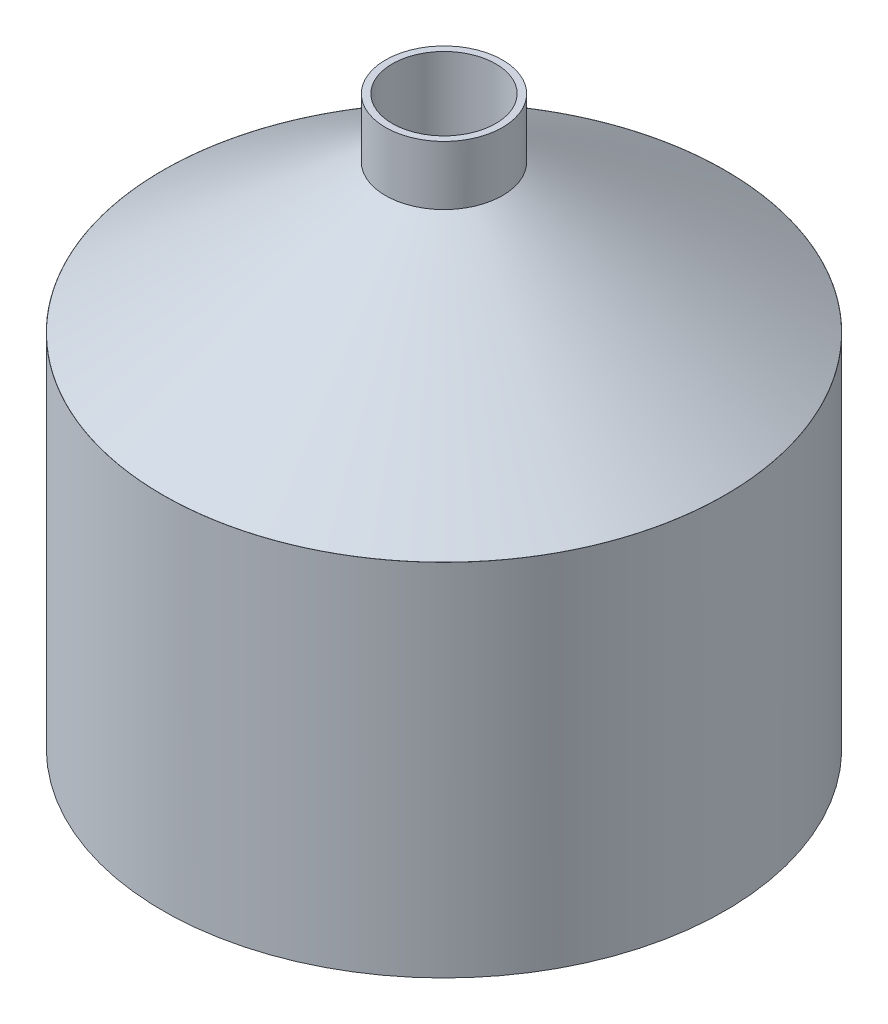
ISO-10303-21;
HEADER;
FILE_DESCRIPTION(('STEP AP214'),'2;1');
FILE_NAME('part.step','',(''),(''),'','','');
FILE_SCHEMA(('AUTOMOTIVE_DESIGN { 1 0 10303 214 1 1 1 1 }'));
ENDSEC;
DATA;
#1=APPLICATION_CONTEXT('core data for automotive mechanical design processes');
#2=APPLICATION_PROTOCOL_DEFINITION('international standard','automotive_design',2000,#1);
#3=PRODUCT_CONTEXT('',#1,'mechanical');
#4=PRODUCT('Part','Part','',(#3));
#5=PRODUCT_RELATED_PRODUCT_CATEGORY('part','',(#4));
#6=PRODUCT_DEFINITION_FORMATION('','',#4);
#7=PRODUCT_DEFINITION_CONTEXT('part definition',#1,'design');
#8=PRODUCT_DEFINITION('design','',#6,#7);
#9=PRODUCT_DEFINITION_SHAPE('','',#8);
#10=(LENGTH_UNIT() NAMED_UNIT(*) SI_UNIT(.MILLI.,.METRE.));
#11=(NAMED_UNIT(*) PLANE_ANGLE_UNIT() SI_UNIT($,.RADIAN.));
#12=(NAMED_UNIT(*) SI_UNIT($,.STERADIAN.) SOLID_ANGLE_UNIT());
#13=UNCERTAINTY_MEASURE_WITH_UNIT(LENGTH_MEASURE(1.E-05),#10,'distance_accuracy_value','');
#14=(GEOMETRIC_REPRESENTATION_CONTEXT(3) GLOBAL_UNCERTAINTY_ASSIGNED_CONTEXT((#13)) GLOBAL_UNIT_ASSIGNED_CONTEXT((#10,
#11,#12)) REPRESENTATION_CONTEXT('',''));
#15=CARTESIAN_POINT('',(0.,0.,0.));
#16=DIRECTION('',(0.,0.,1.));
#17=DIRECTION('',(1.,0.,0.));
#18=AXIS2_PLACEMENT_3D('',#15,#16,#17);
#19=CARTESIAN_POINT('',(0.,80.,0.));
#20=DIRECTION('',(0.,-1.,0.));
#21=DIRECTION('',(0.,0.,-1.));
#22=AXIS2_PLACEMENT_3D('',#19,#20,#21);
#23=CONICAL_SURFACE('',#22,61.5,0.984225915539684);
#24=CARTESIAN_POINT('',(0.,80.,0.));
#25=DIRECTION('',(0.,-1.,0.));
#26=DIRECTION('',(0.,0.,-1.));
#27=AXIS2_PLACEMENT_3D('',#24,#25,#26);
#28=CIRCLE('',#27,61.5);
#29=CARTESIAN_POINT('',(0.,80.,-61.5));
#30=VERTEX_POINT('',#29);
#31=EDGE_CURVE('E92',#30,#30,#28,.T.);
#32=CARTESIAN_POINT('',(0.,112.233095944239,0.));
#33=DIRECTION('',(0.,-1.,0.));
#34=DIRECTION('',(0.,0.,-1.));
#35=AXIS2_PLACEMENT_3D('',#32,#33,#34);
#36=CIRCLE('',#35,13.);
#37=CARTESIAN_POINT('',(0.,112.233095944239,-13.));
#38=VERTEX_POINT('',#37);
#39=EDGE_CURVE('E11',#38,#38,#36,.T.);
#40=CARTESIAN_POINT('',(0.,80.,-61.5));
#41=CARTESIAN_POINT('',(0.,80.3357614160858,-60.9947916666667));
#42=CARTESIAN_POINT('',(0.,80.6715228321717,-60.4895833333333));
#43=CARTESIAN_POINT('',(0.,81.3430456643433,-59.4791666666667));
#44=CARTESIAN_POINT('',(0.,81.6788070804291,-58.9739583333333));
#45=CARTESIAN_POINT('',(0.,82.3503299126008,-57.9635416666667));
#46=CARTESIAN_POINT('',(0.,82.6860913286866,-57.4583333333333));
#47=CARTESIAN_POINT('',(0.,83.3576141608583,-56.4479166666667));
#48=CARTESIAN_POINT('',(0.,83.6933755769441,-55.9427083333333));
#49=CARTESIAN_POINT('',(0.,84.3648984091157,-54.9322916666667));
#50=CARTESIAN_POINT('',(0.,84.7006598252016,-54.4270833333333));
#51=CARTESIAN_POINT('',(0.,85.3721826573732,-53.4166666666667));
#52=CARTESIAN_POINT('',(0.,85.707944073459,-52.9114583333333));
#53=CARTESIAN_POINT('',(0.,86.3794669056307,-51.9010416666667));
#54=CARTESIAN_POINT('',(0.,86.7152283217165,-51.3958333333333));
#55=CARTESIAN_POINT('',(0.,87.3867511538882,-50.3854166666667));
#56=CARTESIAN_POINT('',(0.,87.722512569974,-49.8802083333333));
#57=CARTESIAN_POINT('',(0.,88.3940354021456,-48.8697916666667));
#58=CARTESIAN_POINT('',(0.,88.7297968182315,-48.3645833333333));
#59=CARTESIAN_POINT('',(0.,89.4013196504031,-47.3541666666667));
#60=CARTESIAN_POINT('',(0.,89.737081066489,-46.8489583333333));
#61=CARTESIAN_POINT('',(0.,90.4086038986606,-45.8385416666667));
#62=CARTESIAN_POINT('',(0.,90.7443653147464,-45.3333333333333));
#63=CARTESIAN_POINT('',(0.,91.4158881469181,-44.3229166666667));
#64=CARTESIAN_POINT('',(0.,91.7516495630039,-43.8177083333333));
#65=CARTESIAN_POINT('',(0.,92.4231723951756,-42.8072916666667));
#66=CARTESIAN_POINT('',(0.,92.7589338112614,-42.3020833333333));
#67=CARTESIAN_POINT('',(0.,93.430456643433,-41.2916666666667));
#68=CARTESIAN_POINT('',(0.,93.7662180595189,-40.7864583333333));
#69=CARTESIAN_POINT('',(0.,94.4377408916905,-39.7760416666667));
#70=CARTESIAN_POINT('',(0.,94.7735023077763,-39.2708333333333));
#71=CARTESIAN_POINT('',(0.,95.445025139948,-38.2604166666667));
#72=CARTESIAN_POINT('',(0.,95.7807865560338,-37.7552083333333));
#73=CARTESIAN_POINT('',(0.,96.4523093882055,-36.7447916666667));
#74=CARTESIAN_POINT('',(0.,96.7880708042913,-36.2395833333333));
#75=CARTESIAN_POINT('',(0.,97.459593636463,-35.2291666666667));
#76=CARTESIAN_POINT('',(0.,97.7953550525488,-34.7239583333333));
#77=CARTESIAN_POINT('',(0.,98.4668778847204,-33.7135416666667));
#78=CARTESIAN_POINT('',(0.,98.8026393008063,-33.2083333333333));
#79=CARTESIAN_POINT('',(0.,99.4741621329779,-32.1979166666667));
#80=CARTESIAN_POINT('',(0.,99.8099235490637,-31.6927083333333));
#81=CARTESIAN_POINT('',(0.,100.481446381235,-30.6822916666667));
#82=CARTESIAN_POINT('',(0.,100.817207797321,-30.1770833333333));
#83=CARTESIAN_POINT('',(0.,101.488730629493,-29.1666666666667));
#84=CARTESIAN_POINT('',(0.,101.824492045579,-28.6614583333333));
#85=CARTESIAN_POINT('',(0.,102.49601487775,-27.6510416666667));
#86=CARTESIAN_POINT('',(0.,102.831776293836,-27.1458333333333));
#87=CARTESIAN_POINT('',(0.,103.503299126008,-26.1354166666667));
#88=CARTESIAN_POINT('',(0.,103.839060542094,-25.6302083333333));
#89=CARTESIAN_POINT('',(0.,104.510583374265,-24.6197916666667));
#90=CARTESIAN_POINT('',(0.,104.846344790351,-24.1145833333333));
#91=CARTESIAN_POINT('',(0.,105.517867622523,-23.1041666666667));
#92=CARTESIAN_POINT('',(0.,105.853629038609,-22.5989583333333));
#93=CARTESIAN_POINT('',(0.,106.52515187078,-21.5885416666667));
#94=CARTESIAN_POINT('',(0.,106.860913286866,-21.0833333333333));
#95=CARTESIAN_POINT('',(0.,107.532436119038,-20.0729166666667));
#96=CARTESIAN_POINT('',(0.,107.868197535124,-19.5677083333333));
#97=CARTESIAN_POINT('',(0.,108.539720367295,-18.5572916666667));
#98=CARTESIAN_POINT('',(0.,108.875481783381,-18.0520833333333));
#99=CARTESIAN_POINT('',(0.,109.547004615553,-17.0416666666667));
#100=CARTESIAN_POINT('',(0.,109.882766031639,-16.5364583333333));
#101=CARTESIAN_POINT('',(0.,110.55428886381,-15.5260416666667));
#102=CARTESIAN_POINT('',(0.,110.890050279896,-15.0208333333333));
#103=CARTESIAN_POINT('',(0.,111.561573112068,-14.0104166666666));
#104=CARTESIAN_POINT('',(0.,111.897334528153,-13.5052083333333));
#105=CARTESIAN_POINT('',(0.,112.233095944239,-13.));
#106=B_SPLINE_CURVE_WITH_KNOTS('',3,(#40,#41,#42,#43,#44,#45,#46,#47,#48,#49,#50,#51,#52,#53,
#54,#55,#56,#57,#58,#59,#60,#61,#62,#63,#64,#65,#66,#67,#68,#69,#70,#71,#72,#73,#74,#75,#76,#77,
#78,#79,#80,#81,#82,#83,#84,#85,#86,#87,#88,#89,#90,#91,#92,#93,#94,#95,#96,#97,#98,#99,#100,
#101,#102,#103,#104,#105),.UNSPECIFIED.,.F.,.F.,(4,2,2,2,2,2,2,2,2,2,2,2,2,2,2,2,2,2,2,2,2,2,2,
2,2,2,2,2,2,2,2,2,4),(0.,1.81981886390174,3.63963772780348,5.45945659170523,7.27927545560696,
9.09909431950871,10.9189131834105,12.7387320473122,14.5585509112139,16.3783697751157,
18.1981886390174,20.0180075029192,21.8378263668209,23.6576452307227,25.4774640946244,
27.2972829585261,29.1171018224279,30.9369206863296,32.7567395502314,34.5765584141331,
36.3963772780349,38.2161961419366,40.0360150058383,41.8558338697401,43.6756527336418,
45.4954715975436,47.3152904614453,49.135109325347,50.9549281892488,52.7747470531505,
54.5945659170523,56.414384780954,58.2342036448558),.UNSPECIFIED.);
#107=EDGE_CURVE('BSEAM33',#30,#38,#106,.T.);
#108=ORIENTED_EDGE('',*,*,#31,.T.);
#109=ORIENTED_EDGE('',*,*,#39,.F.);
#110=ORIENTED_EDGE('',*,*,#107,.T.);
#111=ORIENTED_EDGE('',*,*,#107,.F.);
#112=EDGE_LOOP('',(#108,#110,#109,#111));
#113=FACE_BOUND('',#112,.T.);
#114=ADVANCED_FACE('F33',(#113),#23,.F.);
#115=CARTESIAN_POINT('',(0.,117.,0.));
#116=DIRECTION('',(0.,-1.,0.));
#117=DIRECTION('',(0.,0.,-1.));
#118=AXIS2_PLACEMENT_3D('',#115,#116,#117);
#119=CONICAL_SURFACE('',#118,6.8,0.984225915539684);
#120=CARTESIAN_POINT('',(0.,80.,0.));
#121=DIRECTION('',(0.,-1.,0.));
#122=DIRECTION('',(0.,0.,-1.));
#123=AXIS2_PLACEMENT_3D('',#120,#121,#122);
#124=CIRCLE('',#123,62.4725920185996);
#125=CARTESIAN_POINT('',(0.,80.,-62.4725920185996));
#126=VERTEX_POINT('',#125);
#127=EDGE_CURVE('E96',#126,#126,#124,.T.);
#128=CARTESIAN_POINT('',(0.,112.879480518469,0.));
#129=DIRECTION('',(0.,-1.,0.));
#130=DIRECTION('',(0.,0.,-1.));
#131=AXIS2_PLACEMENT_3D('',#128,#129,#130);
#132=CIRCLE('',#131,13.);
#133=CARTESIAN_POINT('',(0.,112.879480518469,-13.));
#134=VERTEX_POINT('',#133);
#135=EDGE_CURVE('E37',#134,#134,#132,.F.);
#136=CARTESIAN_POINT('',(0.,80.,-62.4725920185996));
#137=CARTESIAN_POINT('',(0.,80.342494588734,-61.9572525184058));
#138=CARTESIAN_POINT('',(0.,80.6849891774681,-61.4419130182121));
#139=CARTESIAN_POINT('',(0.,81.3699783549362,-60.4112340178246));
#140=CARTESIAN_POINT('',(0.,81.7124729436702,-59.8958945176309));
#141=CARTESIAN_POINT('',(0.,82.3974621211383,-58.8652155172434));
#142=CARTESIAN_POINT('',(0.,82.7399567098724,-58.3498760170496));
#143=CARTESIAN_POINT('',(0.,83.4249458873405,-57.3191970166621));
#144=CARTESIAN_POINT('',(0.,83.7674404760745,-56.8038575164684));
#145=CARTESIAN_POINT('',(0.,84.4524296535426,-55.7731785160809));
#146=CARTESIAN_POINT('',(0.,84.7949242422767,-55.2578390158871));
#147=CARTESIAN_POINT('',(0.,85.4799134197448,-54.2271600154996));
#148=CARTESIAN_POINT('',(0.,85.8224080084788,-53.7118205153059));
#149=CARTESIAN_POINT('',(0.,86.5073971859469,-52.6811415149184));
#150=CARTESIAN_POINT('',(0.,86.849891774681,-52.1658020147247));
#151=CARTESIAN_POINT('',(0.,87.5348809521491,-51.1351230143372));
#152=CARTESIAN_POINT('',(0.,87.8773755408831,-50.6197835141434));
#153=CARTESIAN_POINT('',(0.,88.5623647183512,-49.5891045137559));
#154=CARTESIAN_POINT('',(0.,88.9048593070852,-49.0737650135622));
#155=CARTESIAN_POINT('',(0.,89.5898484845533,-48.0430860131747));
#156=CARTESIAN_POINT('',(0.,89.9323430732874,-47.527746512981));
#157=CARTESIAN_POINT('',(0.,90.6173322507555,-46.4970675125935));
#158=CARTESIAN_POINT('',(0.,90.9598268394895,-45.9817280123997));
#159=CARTESIAN_POINT('',(0.,91.6448160169576,-44.9510490120122));
#160=CARTESIAN_POINT('',(0.,91.9873106056917,-44.4357095118185));
#161=CARTESIAN_POINT('',(0.,92.6722997831598,-43.405030511431));
#162=CARTESIAN_POINT('',(0.,93.0147943718938,-42.8896910112372));
#163=CARTESIAN_POINT('',(0.,93.6997835493619,-41.8590120108498));
#164=CARTESIAN_POINT('',(0.,94.042278138096,-41.343672510656));
#165=CARTESIAN_POINT('',(0.,94.727267315564,-40.3129935102685));
#166=CARTESIAN_POINT('',(0.,95.0697619042981,-39.7976540100748));
#167=CARTESIAN_POINT('',(0.,95.7547510817662,-38.7669750096873));
#168=CARTESIAN_POINT('',(0.,96.0972456705003,-38.2516355094935));
#169=CARTESIAN_POINT('',(0.,96.7822348479683,-37.220956509106));
#170=CARTESIAN_POINT('',(0.,97.1247294367024,-36.7056170089123));
#171=CARTESIAN_POINT('',(0.,97.8097186141705,-35.6749380085248));
#172=CARTESIAN_POINT('',(0.,98.1522132029045,-35.1595985083311));
#173=CARTESIAN_POINT('',(0.,98.8372023803726,-34.1289195079436));
#174=CARTESIAN_POINT('',(0.,99.1796969691067,-33.6135800077498));
#175=CARTESIAN_POINT('',(0.,99.8646861465748,-32.5829010073623));
#176=CARTESIAN_POINT('',(0.,100.207180735309,-32.0675615071686));
#177=CARTESIAN_POINT('',(0.,100.892169912777,-31.0368825067811));
#178=CARTESIAN_POINT('',(0.,101.234664501511,-30.5215430065873));
#179=CARTESIAN_POINT('',(0.,101.919653678979,-29.4908640061999));
#180=CARTESIAN_POINT('',(0.,102.262148267713,-28.9755245060061));
#181=CARTESIAN_POINT('',(0.,102.947137445181,-27.9448455056186));
#182=CARTESIAN_POINT('',(0.,103.289632033915,-27.4295060054249));
#183=CARTESIAN_POINT('',(0.,103.974621211383,-26.3988270050374));
#184=CARTESIAN_POINT('',(0.,104.317115800117,-25.8834875048436));
#185=CARTESIAN_POINT('',(0.,105.002104977585,-24.8528085044561));
#186=CARTESIAN_POINT('',(0.,105.34459956632,-24.3374690042624));
#187=CARTESIAN_POINT('',(0.,106.029588743788,-23.3067900038749));
#188=CARTESIAN_POINT('',(0.,106.372083332522,-22.7914505036812));
#189=CARTESIAN_POINT('',(0.,107.05707250999,-21.7607715032937));
#190=CARTESIAN_POINT('',(0.,107.399567098724,-21.2454320030999));
#191=CARTESIAN_POINT('',(0.,108.084556276192,-20.2147530027124));
#192=CARTESIAN_POINT('',(0.,108.427050864926,-19.6994135025187));
#193=CARTESIAN_POINT('',(0.,109.112040042394,-18.6687345021312));
#194=CARTESIAN_POINT('',(0.,109.454534631128,-18.1533950019375));
#195=CARTESIAN_POINT('',(0.,110.139523808596,-17.12271600155));
#196=CARTESIAN_POINT('',(0.,110.48201839733,-16.6073765013562));
#197=CARTESIAN_POINT('',(0.,111.167007574798,-15.5766975009687));
#198=CARTESIAN_POINT('',(0.,111.509502163532,-15.061358000775));
#199=CARTESIAN_POINT('',(0.,112.194491341,-14.0306790003875));
#200=CARTESIAN_POINT('',(0.,112.536985929735,-13.5153395001937));
#201=CARTESIAN_POINT('',(0.,112.879480518469,-13.));
#202=B_SPLINE_CURVE_WITH_KNOTS('',3,(#136,#137,#138,#139,#140,#141,#142,#143,#144,#145,#146,
#147,#148,#149,#150,#151,#152,#153,#154,#155,#156,#157,#158,#159,#160,#161,#162,#163,#164,#165,
#166,#167,#168,#169,#170,#171,#172,#173,#174,#175,#176,#177,#178,#179,#180,#181,#182,#183,#184,
#185,#186,#187,#188,#189,#190,#191,#192,#193,#194,#195,#196,#197,#198,#199,#200,#201),
.UNSPECIFIED.,.F.,.F.,(4,2,2,2,2,2,2,2,2,2,2,2,2,2,2,2,2,2,2,2,2,2,2,2,2,2,2,2,2,2,2,2,4),(0.,
1.85631249900129,3.71262499800257,5.56893749700386,7.42524999600514,9.28156249500643,
11.1378749940077,12.994187493009,14.8504999920103,16.7068124910116,18.5631249900129,
20.4194374890141,22.2757499880154,24.1320624870167,25.988374986018,27.8446874850193,
29.7009999840206,31.5573124830219,33.4136249820231,35.2699374810244,37.1262499800257,
38.982562479027,40.8388749780283,42.6951874770295,44.5514999760308,46.4078124750321,
48.2641249740334,50.1204374730347,51.976749972036,53.8330624710373,55.6893749700385,
57.5456874690398,59.4019999680411),.UNSPECIFIED.);
#203=EDGE_CURVE('BSEAM119',#126,#134,#202,.T.);
#204=ORIENTED_EDGE('',*,*,#127,.F.);
#205=ORIENTED_EDGE('',*,*,#135,.F.);
#206=ORIENTED_EDGE('',*,*,#203,.T.);
#207=ORIENTED_EDGE('',*,*,#203,.F.);
#208=EDGE_LOOP('',(#204,#206,#205,#207));
#209=FACE_BOUND('',#208,.T.);
#210=ADVANCED_FACE('F119',(#209),#119,.T.);
#211=CARTESIAN_POINT('',(0.,80.,0.));
#212=DIRECTION('',(0.,1.,0.));
#213=DIRECTION('',(0.,0.,1.));
#214=AXIS2_PLACEMENT_3D('',#211,#212,#213);
#215=PLANE('',#214);
#216=CARTESIAN_POINT('',(0.,80.,0.));
#217=DIRECTION('',(0.,1.,0.));
#218=DIRECTION('',(0.,0.,1.));
#219=AXIS2_PLACEMENT_3D('',#216,#217,#218);
#220=CIRCLE('',#219,62.5);
#221=CARTESIAN_POINT('',(0.,80.,62.5));
#222=VERTEX_POINT('',#221);
#223=EDGE_CURVE('E107',#222,#222,#220,.T.);
#224=ORIENTED_EDGE('',*,*,#223,.T.);
#225=EDGE_LOOP('',(#224));
#226=FACE_BOUND('',#225,.T.);
#227=ORIENTED_EDGE('',*,*,#127,.T.);
#228=EDGE_LOOP('',(#227));
#229=FACE_BOUND('',#228,.T.);
#230=ADVANCED_FACE('F121',(#226,#229),#215,.T.);
#231=CARTESIAN_POINT('',(0.,0.,0.));
#232=DIRECTION('',(0.,1.,0.));
#233=DIRECTION('',(0.,0.,1.));
#234=AXIS2_PLACEMENT_3D('',#231,#232,#233);
#235=PLANE('',#234);
#236=CARTESIAN_POINT('',(0.,0.,0.));
#237=DIRECTION('',(0.,1.,0.));
#238=DIRECTION('',(0.,0.,1.));
#239=AXIS2_PLACEMENT_3D('',#236,#237,#238);
#240=CIRCLE('',#239,61.5);
#241=CARTESIAN_POINT('',(-3.8,0.,-61.3824893597515));
#242=VERTEX_POINT('',#241);
#243=CARTESIAN_POINT('',(3.8,0.,-61.3824893597515));
#244=VERTEX_POINT('',#243);
#245=EDGE_CURVE('E104',#242,#244,#240,.T.);
#246=ORIENTED_EDGE('',*,*,#245,.T.);
#247=DIRECTION('',(0.,0.,-1.));
#248=VECTOR('',#247,1.);
#249=CARTESIAN_POINT('',(3.8,0.,0.));
#250=LINE('',#249,#248);
#251=CARTESIAN_POINT('',(3.8,0.,-62.384373043255));
#252=VERTEX_POINT('',#251);
#253=EDGE_CURVE('E93',#244,#252,#250,.T.);
#254=ORIENTED_EDGE('',*,*,#253,.T.);
#255=CARTESIAN_POINT('',(0.,0.,0.));
#256=DIRECTION('',(0.,1.,0.));
#257=DIRECTION('',(0.,0.,1.));
#258=AXIS2_PLACEMENT_3D('',#255,#256,#257);
#259=CIRCLE('',#258,62.5);
#260=CARTESIAN_POINT('',(-3.8,0.,-62.384373043255));
#261=VERTEX_POINT('',#260);
#262=EDGE_CURVE('E91',#261,#252,#259,.T.);
#263=ORIENTED_EDGE('',*,*,#262,.F.);
#264=DIRECTION('',(0.,0.,1.));
#265=VECTOR('',#264,1.);
#266=CARTESIAN_POINT('',(-3.8,0.,0.));
#267=LINE('',#266,#265);
#268=EDGE_CURVE('E80',#261,#242,#267,.T.);
#269=ORIENTED_EDGE('',*,*,#268,.T.);
#270=EDGE_LOOP('',(#246,#254,#263,#269));
#271=FACE_BOUND('',#270,.T.);
#272=ADVANCED_FACE('F128',(#271),#235,.F.);
#273=CARTESIAN_POINT('',(0.,80.,0.));
#274=DIRECTION('',(0.,-1.,0.));
#275=DIRECTION('',(0.,0.,-1.));
#276=AXIS2_PLACEMENT_3D('',#273,#274,#275);
#277=CYLINDRICAL_SURFACE('',#276,62.5);
#278=ORIENTED_EDGE('',*,*,#262,.T.);
#279=DIRECTION('',(0.,-1.,0.));
#280=VECTOR('',#279,1.);
#281=CARTESIAN_POINT('',(3.8,80.,-62.384373043255));
#282=LINE('',#281,#280);
#283=CARTESIAN_POINT('',(3.8,21.7062239096552,-62.384373043255));
#284=VERTEX_POINT('',#283);
#285=EDGE_CURVE('E56',#252,#284,#282,.F.);
#286=ORIENTED_EDGE('',*,*,#285,.T.);
#287=CARTESIAN_POINT('',(0.,21.7062239096552,0.));
#288=DIRECTION('',(0.,1.,0.));
#289=DIRECTION('',(0.,0.,1.));
#290=AXIS2_PLACEMENT_3D('',#287,#288,#289);
#291=CIRCLE('',#290,62.5);
#292=CARTESIAN_POINT('',(-3.8,21.7062239096552,-62.384373043255));
#293=VERTEX_POINT('',#292);
#294=EDGE_CURVE('E74',#284,#293,#291,.T.);
#295=ORIENTED_EDGE('',*,*,#294,.T.);
#296=DIRECTION('',(0.,-1.,0.));
#297=VECTOR('',#296,1.);
#298=CARTESIAN_POINT('',(-3.8,80.,-62.384373043255));
#299=LINE('',#298,#297);
#300=EDGE_CURVE('E98',#293,#261,#299,.T.);
#301=ORIENTED_EDGE('',*,*,#300,.T.);
#302=EDGE_LOOP('',(#278,#286,#295,#301));
#303=FACE_BOUND('',#302,.T.);
#304=ORIENTED_EDGE('',*,*,#223,.F.);
#305=EDGE_LOOP('',(#304));
#306=FACE_BOUND('',#305,.T.);
#307=ADVANCED_FACE('F35',(#303,#306),#277,.T.);
#308=CARTESIAN_POINT('',(0.,80.,0.));
#309=DIRECTION('',(0.,-1.,0.));
#310=DIRECTION('',(0.,0.,-1.));
#311=AXIS2_PLACEMENT_3D('',#308,#309,#310);
#312=CYLINDRICAL_SURFACE('',#311,61.5);
#313=DIRECTION('',(0.,-1.,0.));
#314=VECTOR('',#313,1.);
#315=CARTESIAN_POINT('',(3.8,80.,-61.3824893597515));
#316=LINE('',#315,#314);
#317=CARTESIAN_POINT('',(3.8,21.7062239096552,-61.3824893597515));
#318=VERTEX_POINT('',#317);
#319=EDGE_CURVE('E84',#244,#318,#316,.F.);
#320=ORIENTED_EDGE('',*,*,#319,.F.);
#321=ORIENTED_EDGE('',*,*,#245,.F.);
#322=DIRECTION('',(0.,-1.,0.));
#323=VECTOR('',#322,1.);
#324=CARTESIAN_POINT('',(-3.8,80.,-61.3824893597515));
#325=LINE('',#324,#323);
#326=CARTESIAN_POINT('',(-3.8,21.7062239096552,-61.3824893597515));
#327=VERTEX_POINT('',#326);
#328=EDGE_CURVE('E113',#327,#242,#325,.T.);
#329=ORIENTED_EDGE('',*,*,#328,.F.);
#330=CARTESIAN_POINT('',(0.,21.7062239096552,0.));
#331=DIRECTION('',(0.,1.,0.));
#332=DIRECTION('',(0.,0.,1.));
#333=AXIS2_PLACEMENT_3D('',#330,#331,#332);
#334=CIRCLE('',#333,61.5);
#335=EDGE_CURVE('E110',#318,#327,#334,.T.);
#336=ORIENTED_EDGE('',*,*,#335,.F.);
#337=EDGE_LOOP('',(#320,#321,#329,#336));
#338=FACE_BOUND('',#337,.T.);
#339=ORIENTED_EDGE('',*,*,#31,.F.);
#340=EDGE_LOOP('',(#339));
#341=FACE_BOUND('',#340,.T.);
#342=ADVANCED_FACE('F137',(#338,#341),#312,.F.);
#343=CARTESIAN_POINT('',(3.8,21.7062239096552,-80.));
#344=DIRECTION('',(1.,0.,0.));
#345=DIRECTION('',(0.,0.,-1.));
#346=AXIS2_PLACEMENT_3D('',#343,#344,#345);
#347=PLANE('',#346);
#348=ORIENTED_EDGE('',*,*,#253,.F.);
#349=ORIENTED_EDGE('',*,*,#319,.T.);
#350=DIRECTION('',(0.,0.,1.));
#351=VECTOR('',#350,1.);
#352=CARTESIAN_POINT('',(3.8,21.7062239096552,-80.));
#353=LINE('',#352,#351);
#354=EDGE_CURVE('E49',#284,#318,#353,.T.);
#355=ORIENTED_EDGE('',*,*,#354,.F.);
#356=ORIENTED_EDGE('',*,*,#285,.F.);
#357=EDGE_LOOP('',(#348,#349,#355,#356));
#358=FACE_BOUND('',#357,.T.);
#359=ADVANCED_FACE('F82',(#358),#347,.F.);
#360=CARTESIAN_POINT('',(-3.8,21.7062239096552,-80.));
#361=DIRECTION('',(-1.,0.,0.));
#362=DIRECTION('',(0.,0.,1.));
#363=AXIS2_PLACEMENT_3D('',#360,#361,#362);
#364=PLANE('',#363);
#365=DIRECTION('',(0.,0.,1.));
#366=VECTOR('',#365,1.);
#367=CARTESIAN_POINT('',(-3.8,21.7062239096552,-80.));
#368=LINE('',#367,#366);
#369=EDGE_CURVE('E77',#293,#327,#368,.T.);
#370=ORIENTED_EDGE('',*,*,#369,.T.);
#371=ORIENTED_EDGE('',*,*,#328,.T.);
#372=ORIENTED_EDGE('',*,*,#268,.F.);
#373=ORIENTED_EDGE('',*,*,#300,.F.);
#374=EDGE_LOOP('',(#370,#371,#372,#373));
#375=FACE_BOUND('',#374,.T.);
#376=ADVANCED_FACE('F150',(#375),#364,.F.);
#377=CARTESIAN_POINT('',(-3.8,21.7062239096552,-80.));
#378=DIRECTION('',(0.,1.,0.));
#379=DIRECTION('',(0.,0.,1.));
#380=AXIS2_PLACEMENT_3D('',#377,#378,#379);
#381=PLANE('',#380);
#382=ORIENTED_EDGE('',*,*,#354,.T.);
#383=ORIENTED_EDGE('',*,*,#335,.T.);
#384=ORIENTED_EDGE('',*,*,#369,.F.);
#385=ORIENTED_EDGE('',*,*,#294,.F.);
#386=EDGE_LOOP('',(#382,#383,#384,#385));
#387=FACE_BOUND('',#386,.T.);
#388=ADVANCED_FACE('F75',(#387),#381,.F.);
#389=CARTESIAN_POINT('',(0.,126.,0.));
#390=DIRECTION('',(0.,-1.,0.));
#391=DIRECTION('',(0.,0.,-1.));
#392=AXIS2_PLACEMENT_3D('',#389,#390,#391);
#393=CYLINDRICAL_SURFACE('',#392,13.);
#394=CARTESIAN_POINT('',(0.,106.,0.));
#395=DIRECTION('',(0.,1.,0.));
#396=DIRECTION('',(0.,0.,1.));
#397=AXIS2_PLACEMENT_3D('',#394,#395,#396);
#398=CIRCLE('',#397,13.);
#399=CARTESIAN_POINT('',(0.,106.,13.));
#400=VERTEX_POINT('',#399);
#401=EDGE_CURVE('E154',#400,#400,#398,.T.);
#402=ORIENTED_EDGE('',*,*,#401,.T.);
#403=EDGE_LOOP('',(#402));
#404=FACE_BOUND('',#403,.T.);
#405=ORIENTED_EDGE('',*,*,#39,.T.);
#406=EDGE_LOOP('',(#405));
#407=FACE_BOUND('',#406,.T.);
#408=ADVANCED_FACE('F180',(#404,#407),#393,.T.);
#409=CARTESIAN_POINT('',(0.,126.,0.));
#410=DIRECTION('',(0.,1.,0.));
#411=DIRECTION('',(0.,0.,1.));
#412=AXIS2_PLACEMENT_3D('',#409,#410,#411);
#413=CIRCLE('',#412,13.);
#414=CARTESIAN_POINT('',(0.,126.,13.));
#415=VERTEX_POINT('',#414);
#416=EDGE_CURVE('E86',#415,#415,#413,.T.);
#417=ORIENTED_EDGE('',*,*,#416,.F.);
#418=EDGE_LOOP('',(#417));
#419=FACE_BOUND('',#418,.T.);
#420=ORIENTED_EDGE('',*,*,#135,.T.);
#421=EDGE_LOOP('',(#420));
#422=FACE_BOUND('',#421,.T.);
#423=ADVANCED_FACE('F117',(#419,#422),#393,.T.);
#424=CARTESIAN_POINT('',(0.,126.,0.));
#425=DIRECTION('',(0.,1.,0.));
#426=DIRECTION('',(0.,0.,1.));
#427=AXIS2_PLACEMENT_3D('',#424,#425,#426);
#428=PLANE('',#427);
#429=ORIENTED_EDGE('',*,*,#416,.T.);
#430=EDGE_LOOP('',(#429));
#431=FACE_BOUND('',#430,.T.);
#432=CARTESIAN_POINT('',(0.,126.,0.));
#433=DIRECTION('',(0.,1.,0.));
#434=DIRECTION('',(0.,0.,1.));
#435=AXIS2_PLACEMENT_3D('',#432,#433,#434);
#436=CIRCLE('',#435,11.5);
#437=CARTESIAN_POINT('',(0.,126.,11.5));
#438=VERTEX_POINT('',#437);
#439=EDGE_CURVE('E157',#438,#438,#436,.T.);
#440=ORIENTED_EDGE('',*,*,#439,.F.);
#441=EDGE_LOOP('',(#440));
#442=FACE_BOUND('',#441,.T.);
#443=ADVANCED_FACE('F169',(#431,#442),#428,.T.);
#444=CARTESIAN_POINT('',(0.,106.,0.));
#445=DIRECTION('',(0.,1.,0.));
#446=DIRECTION('',(0.,0.,1.));
#447=AXIS2_PLACEMENT_3D('',#444,#445,#446);
#448=PLANE('',#447);
#449=ORIENTED_EDGE('',*,*,#401,.F.);
#450=EDGE_LOOP('',(#449));
#451=FACE_BOUND('',#450,.T.);
#452=CARTESIAN_POINT('',(0.,106.,0.));
#453=DIRECTION('',(0.,1.,0.));
#454=DIRECTION('',(0.,0.,1.));
#455=AXIS2_PLACEMENT_3D('',#452,#453,#454);
#456=CIRCLE('',#455,11.5);
#457=CARTESIAN_POINT('',(0.,106.,11.5));
#458=VERTEX_POINT('',#457);
#459=EDGE_CURVE('E160',#458,#458,#456,.T.);
#460=ORIENTED_EDGE('',*,*,#459,.T.);
#461=EDGE_LOOP('',(#460));
#462=FACE_BOUND('',#461,.T.);
#463=ADVANCED_FACE('F171',(#451,#462),#448,.F.);
#464=CARTESIAN_POINT('',(0.,126.,0.));
#465=DIRECTION('',(0.,-1.,0.));
#466=DIRECTION('',(0.,0.,-1.));
#467=AXIS2_PLACEMENT_3D('',#464,#465,#466);
#468=CYLINDRICAL_SURFACE('',#467,11.5);
#469=ORIENTED_EDGE('',*,*,#439,.T.);
#470=EDGE_LOOP('',(#469));
#471=FACE_BOUND('',#470,.T.);
#472=ORIENTED_EDGE('',*,*,#459,.F.);
#473=EDGE_LOOP('',(#472));
#474=FACE_BOUND('',#473,.T.);
#475=ADVANCED_FACE('F166',(#471,#474),#468,.F.);
#476=CLOSED_SHELL('',(#114,#210,#230,#272,#307,#342,#359,#376,#388,#408,#423,#443,#463,#475));
#477=MANIFOLD_SOLID_BREP('B2',#476);
#478=ADVANCED_BREP_SHAPE_REPRESENTATION('',(#18,#477),#14);
#479=SHAPE_DEFINITION_REPRESENTATION(#9,#478);
ENDSEC;
END-ISO-10303-21;
